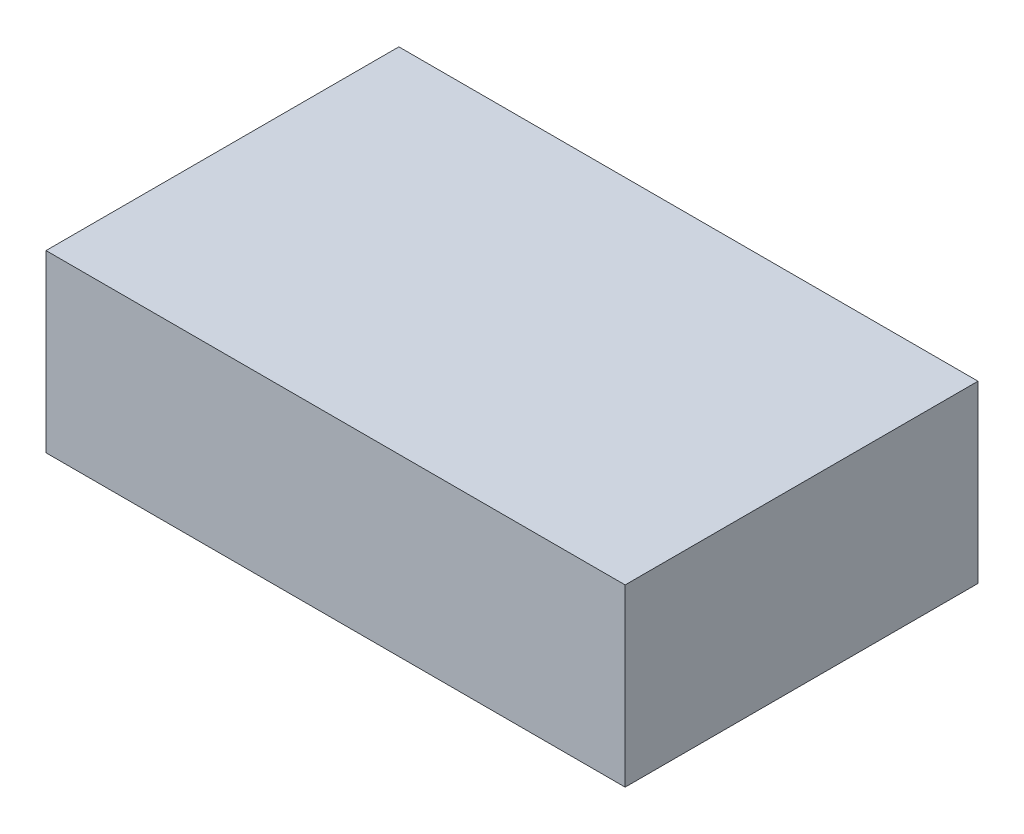
ISO-10303-21;
HEADER;
FILE_DESCRIPTION(('STEP AP214'),'2;1');
FILE_NAME('part.step','',(''),(''),'','','');
FILE_SCHEMA(('AUTOMOTIVE_DESIGN { 1 0 10303 214 1 1 1 1 }'));
ENDSEC;
DATA;
#1=APPLICATION_CONTEXT('core data for automotive mechanical design processes');
#2=APPLICATION_PROTOCOL_DEFINITION('international standard','automotive_design',2000,#1);
#3=PRODUCT_CONTEXT('',#1,'mechanical');
#4=PRODUCT('Part','Part','',(#3));
#5=PRODUCT_RELATED_PRODUCT_CATEGORY('part','',(#4));
#6=PRODUCT_DEFINITION_FORMATION('','',#4);
#7=PRODUCT_DEFINITION_CONTEXT('part definition',#1,'design');
#8=PRODUCT_DEFINITION('design','',#6,#7);
#9=PRODUCT_DEFINITION_SHAPE('','',#8);
#10=(LENGTH_UNIT() NAMED_UNIT(*) SI_UNIT(.MILLI.,.METRE.));
#11=(NAMED_UNIT(*) PLANE_ANGLE_UNIT() SI_UNIT($,.RADIAN.));
#12=(NAMED_UNIT(*) SI_UNIT($,.STERADIAN.) SOLID_ANGLE_UNIT());
#13=UNCERTAINTY_MEASURE_WITH_UNIT(LENGTH_MEASURE(1.E-05),#10,'distance_accuracy_value','');
#14=(GEOMETRIC_REPRESENTATION_CONTEXT(3) GLOBAL_UNCERTAINTY_ASSIGNED_CONTEXT((#13)) GLOBAL_UNIT_ASSIGNED_CONTEXT((#10,
#11,#12)) REPRESENTATION_CONTEXT('',''));
#15=CARTESIAN_POINT('',(0.,0.,0.));
#16=DIRECTION('',(0.,0.,1.));
#17=DIRECTION('',(1.,0.,0.));
#18=AXIS2_PLACEMENT_3D('',#15,#16,#17);
#19=CARTESIAN_POINT('',(41.989912938818,25.4,-25.5840179927771));
#20=DIRECTION('',(-1.,0.,0.));
#21=DIRECTION('',(0.,0.,1.));
#22=AXIS2_PLACEMENT_3D('',#19,#20,#21);
#23=PLANE('',#22);
#24=DIRECTION('',(0.,0.,-1.));
#25=VECTOR('',#24,1.);
#26=CARTESIAN_POINT('',(41.989912938818,0.,-25.5840179927771));
#27=LINE('',#26,#25);
#28=CARTESIAN_POINT('',(41.989912938818,0.,25.5840179927771));
#29=VERTEX_POINT('',#28);
#30=CARTESIAN_POINT('',(41.989912938818,0.,-25.5840179927771));
#31=VERTEX_POINT('',#30);
#32=EDGE_CURVE('E102',#29,#31,#27,.T.);
#33=ORIENTED_EDGE('',*,*,#32,.T.);
#34=DIRECTION('',(0.,-1.,0.));
#35=VECTOR('',#34,1.);
#36=CARTESIAN_POINT('',(41.989912938818,25.4,-25.5840179927771));
#37=LINE('',#36,#35);
#38=CARTESIAN_POINT('',(41.989912938818,25.4,-25.5840179927771));
#39=VERTEX_POINT('',#38);
#40=EDGE_CURVE('E11',#39,#31,#37,.T.);
#41=ORIENTED_EDGE('',*,*,#40,.F.);
#42=DIRECTION('',(0.,0.,-1.));
#43=VECTOR('',#42,1.);
#44=CARTESIAN_POINT('',(41.989912938818,25.4,-25.5840179927771));
#45=LINE('',#44,#43);
#46=CARTESIAN_POINT('',(41.989912938818,25.4,25.5840179927771));
#47=VERTEX_POINT('',#46);
#48=EDGE_CURVE('E89',#47,#39,#45,.T.);
#49=ORIENTED_EDGE('',*,*,#48,.F.);
#50=DIRECTION('',(0.,-1.,0.));
#51=VECTOR('',#50,1.);
#52=CARTESIAN_POINT('',(41.989912938818,25.4,25.5840179927771));
#53=LINE('',#52,#51);
#54=EDGE_CURVE('E98',#47,#29,#53,.T.);
#55=ORIENTED_EDGE('',*,*,#54,.T.);
#56=EDGE_LOOP('',(#33,#41,#49,#55));
#57=FACE_BOUND('',#56,.T.);
#58=ADVANCED_FACE('F38',(#57),#23,.F.);
#59=CARTESIAN_POINT('',(-41.989912938818,25.4,-25.5840179927771));
#60=DIRECTION('',(0.,0.,1.));
#61=DIRECTION('',(1.,0.,0.));
#62=AXIS2_PLACEMENT_3D('',#59,#60,#61);
#63=PLANE('',#62);
#64=DIRECTION('',(-1.,0.,0.));
#65=VECTOR('',#64,1.);
#66=CARTESIAN_POINT('',(-41.989912938818,0.,-25.5840179927771));
#67=LINE('',#66,#65);
#68=CARTESIAN_POINT('',(-41.989912938818,0.,-25.5840179927771));
#69=VERTEX_POINT('',#68);
#70=EDGE_CURVE('E93',#31,#69,#67,.T.);
#71=ORIENTED_EDGE('',*,*,#70,.T.);
#72=DIRECTION('',(0.,-1.,0.));
#73=VECTOR('',#72,1.);
#74=CARTESIAN_POINT('',(-41.989912938818,25.4,-25.5840179927771));
#75=LINE('',#74,#73);
#76=CARTESIAN_POINT('',(-41.989912938818,25.4,-25.5840179927771));
#77=VERTEX_POINT('',#76);
#78=EDGE_CURVE('E46',#77,#69,#75,.T.);
#79=ORIENTED_EDGE('',*,*,#78,.F.);
#80=DIRECTION('',(-1.,0.,0.));
#81=VECTOR('',#80,1.);
#82=CARTESIAN_POINT('',(-41.989912938818,25.4,-25.5840179927771));
#83=LINE('',#82,#81);
#84=EDGE_CURVE('E84',#39,#77,#83,.T.);
#85=ORIENTED_EDGE('',*,*,#84,.F.);
#86=ORIENTED_EDGE('',*,*,#40,.T.);
#87=EDGE_LOOP('',(#71,#79,#85,#86));
#88=FACE_BOUND('',#87,.T.);
#89=ADVANCED_FACE('F92',(#88),#63,.F.);
#90=CARTESIAN_POINT('',(-41.989912938818,25.4,-25.5840179927771));
#91=DIRECTION('',(1.,0.,0.));
#92=DIRECTION('',(0.,0.,-1.));
#93=AXIS2_PLACEMENT_3D('',#90,#91,#92);
#94=PLANE('',#93);
#95=DIRECTION('',(0.,0.,1.));
#96=VECTOR('',#95,1.);
#97=CARTESIAN_POINT('',(-41.989912938818,0.,-25.5840179927771));
#98=LINE('',#97,#96);
#99=CARTESIAN_POINT('',(-41.989912938818,0.,25.5840179927771));
#100=VERTEX_POINT('',#99);
#101=EDGE_CURVE('E71',#69,#100,#98,.T.);
#102=ORIENTED_EDGE('',*,*,#101,.T.);
#103=DIRECTION('',(0.,-1.,0.));
#104=VECTOR('',#103,1.);
#105=CARTESIAN_POINT('',(-41.989912938818,25.4,25.5840179927771));
#106=LINE('',#105,#104);
#107=CARTESIAN_POINT('',(-41.989912938818,25.4,25.5840179927771));
#108=VERTEX_POINT('',#107);
#109=EDGE_CURVE('E94',#108,#100,#106,.T.);
#110=ORIENTED_EDGE('',*,*,#109,.F.);
#111=DIRECTION('',(0.,0.,1.));
#112=VECTOR('',#111,1.);
#113=CARTESIAN_POINT('',(-41.989912938818,25.4,-25.5840179927771));
#114=LINE('',#113,#112);
#115=EDGE_CURVE('E87',#77,#108,#114,.T.);
#116=ORIENTED_EDGE('',*,*,#115,.F.);
#117=ORIENTED_EDGE('',*,*,#78,.T.);
#118=EDGE_LOOP('',(#102,#110,#116,#117));
#119=FACE_BOUND('',#118,.T.);
#120=ADVANCED_FACE('F95',(#119),#94,.F.);
#121=CARTESIAN_POINT('',(-41.989912938818,25.4,25.5840179927771));
#122=DIRECTION('',(0.,0.,-1.));
#123=DIRECTION('',(-1.,0.,0.));
#124=AXIS2_PLACEMENT_3D('',#121,#122,#123);
#125=PLANE('',#124);
#126=DIRECTION('',(1.,0.,0.));
#127=VECTOR('',#126,1.);
#128=CARTESIAN_POINT('',(-41.989912938818,0.,25.5840179927771));
#129=LINE('',#128,#127);
#130=EDGE_CURVE('E77',#100,#29,#129,.T.);
#131=ORIENTED_EDGE('',*,*,#130,.T.);
#132=ORIENTED_EDGE('',*,*,#54,.F.);
#133=DIRECTION('',(1.,0.,0.));
#134=VECTOR('',#133,1.);
#135=CARTESIAN_POINT('',(-41.989912938818,25.4,25.5840179927771));
#136=LINE('',#135,#134);
#137=EDGE_CURVE('E54',#108,#47,#136,.T.);
#138=ORIENTED_EDGE('',*,*,#137,.F.);
#139=ORIENTED_EDGE('',*,*,#109,.T.);
#140=EDGE_LOOP('',(#131,#132,#138,#139));
#141=FACE_BOUND('',#140,.T.);
#142=ADVANCED_FACE('F109',(#141),#125,.F.);
#143=CARTESIAN_POINT('',(0.,25.4,0.));
#144=DIRECTION('',(0.,1.,0.));
#145=DIRECTION('',(0.,0.,1.));
#146=AXIS2_PLACEMENT_3D('',#143,#144,#145);
#147=PLANE('',#146);
#148=ORIENTED_EDGE('',*,*,#48,.T.);
#149=ORIENTED_EDGE('',*,*,#84,.T.);
#150=ORIENTED_EDGE('',*,*,#115,.T.);
#151=ORIENTED_EDGE('',*,*,#137,.T.);
#152=EDGE_LOOP('',(#148,#149,#150,#151));
#153=FACE_BOUND('',#152,.T.);
#154=ADVANCED_FACE('F85',(#153),#147,.T.);
#155=CARTESIAN_POINT('',(0.,0.,0.));
#156=DIRECTION('',(0.,1.,0.));
#157=DIRECTION('',(0.,0.,1.));
#158=AXIS2_PLACEMENT_3D('',#155,#156,#157);
#159=PLANE('',#158);
#160=ORIENTED_EDGE('',*,*,#32,.F.);
#161=ORIENTED_EDGE('',*,*,#130,.F.);
#162=ORIENTED_EDGE('',*,*,#101,.F.);
#163=ORIENTED_EDGE('',*,*,#70,.F.);
#164=EDGE_LOOP('',(#160,#161,#162,#163));
#165=FACE_BOUND('',#164,.T.);
#166=ADVANCED_FACE('F112',(#165),#159,.F.);
#167=CLOSED_SHELL('',(#58,#89,#120,#142,#154,#166));
#168=MANIFOLD_SOLID_BREP('B2',#167);
#169=ADVANCED_BREP_SHAPE_REPRESENTATION('',(#18,#168),#14);
#170=SHAPE_DEFINITION_REPRESENTATION(#9,#169);
ENDSEC;
END-ISO-10303-21;
